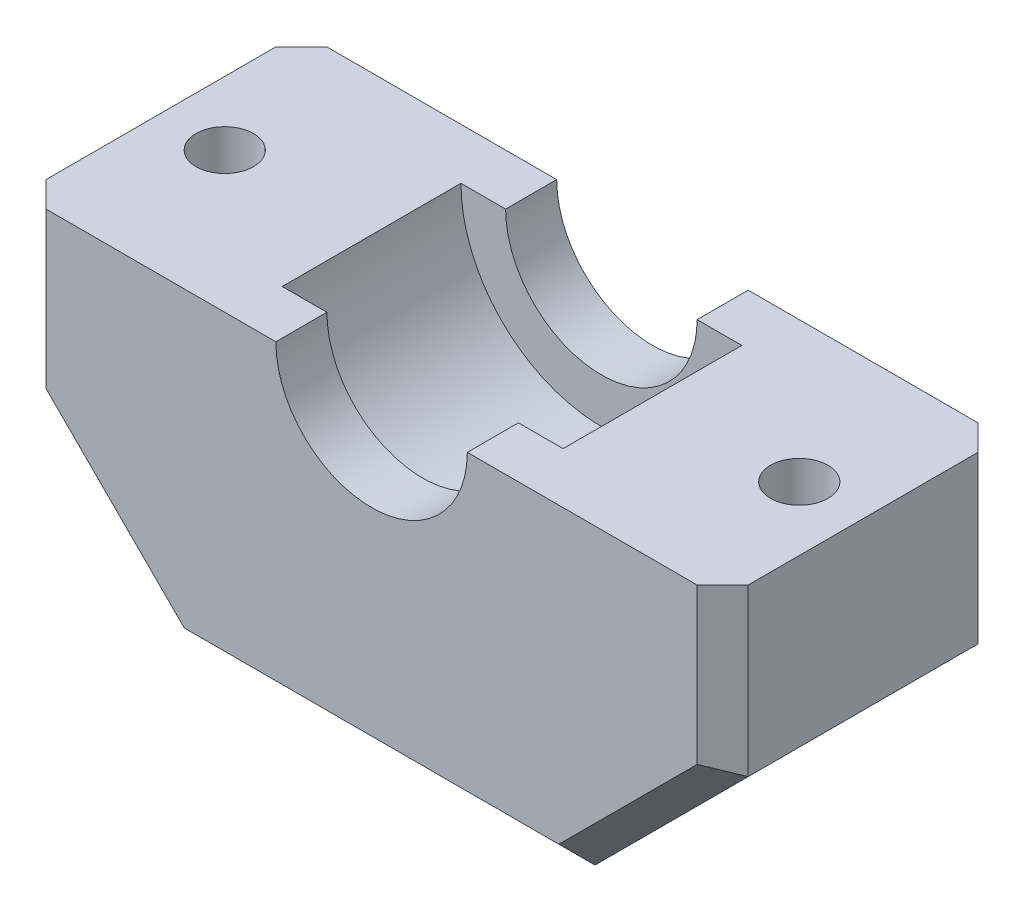
ISO-10303-21;
HEADER;
FILE_DESCRIPTION(('STEP AP214'),'2;1');
FILE_NAME('part.step','',(''),(''),'','','');
FILE_SCHEMA(('AUTOMOTIVE_DESIGN { 1 0 10303 214 1 1 1 1 }'));
ENDSEC;
DATA;
#1=APPLICATION_CONTEXT('core data for automotive mechanical design processes');
#2=APPLICATION_PROTOCOL_DEFINITION('international standard','automotive_design',2000,#1);
#3=PRODUCT_CONTEXT('',#1,'mechanical');
#4=PRODUCT('Part','Part','',(#3));
#5=PRODUCT_RELATED_PRODUCT_CATEGORY('part','',(#4));
#6=PRODUCT_DEFINITION_FORMATION('','',#4);
#7=PRODUCT_DEFINITION_CONTEXT('part definition',#1,'design');
#8=PRODUCT_DEFINITION('design','',#6,#7);
#9=PRODUCT_DEFINITION_SHAPE('','',#8);
#10=(LENGTH_UNIT() NAMED_UNIT(*) SI_UNIT(.MILLI.,.METRE.));
#11=(NAMED_UNIT(*) PLANE_ANGLE_UNIT() SI_UNIT($,.RADIAN.));
#12=(NAMED_UNIT(*) SI_UNIT($,.STERADIAN.) SOLID_ANGLE_UNIT());
#13=UNCERTAINTY_MEASURE_WITH_UNIT(LENGTH_MEASURE(1.E-05),#10,'distance_accuracy_value','');
#14=(GEOMETRIC_REPRESENTATION_CONTEXT(3) GLOBAL_UNCERTAINTY_ASSIGNED_CONTEXT((#13)) GLOBAL_UNIT_ASSIGNED_CONTEXT((#10,
#11,#12)) REPRESENTATION_CONTEXT('',''));
#15=CARTESIAN_POINT('',(0.,0.,0.));
#16=DIRECTION('',(0.,0.,1.));
#17=DIRECTION('',(1.,0.,0.));
#18=AXIS2_PLACEMENT_3D('',#15,#16,#17);
#19=CARTESIAN_POINT('',(-21.485549132948,2.02890173410404,39.1311896062463));
#20=DIRECTION('',(0.,0.,-1.));
#21=DIRECTION('',(-1.,0.,0.));
#22=AXIS2_PLACEMENT_3D('',#19,#20,#21);
#23=CYLINDRICAL_SURFACE('',#22,11.);
#24=DIRECTION('',(0.,0.,-1.));
#25=VECTOR('',#24,1.);
#26=CARTESIAN_POINT('',(-10.485549132948,2.02890173410404,39.1311896062463));
#27=LINE('',#26,#25);
#28=CARTESIAN_POINT('',(-10.485549132948,2.02890173410404,-4.));
#29=VERTEX_POINT('',#28);
#30=CARTESIAN_POINT('',(-10.485549132948,2.02890173410404,-18.));
#31=VERTEX_POINT('',#30);
#32=EDGE_CURVE('E182',#29,#31,#27,.T.);
#33=ORIENTED_EDGE('',*,*,#32,.T.);
#34=CARTESIAN_POINT('',(-21.485549132948,2.02890173410404,-18.));
#35=DIRECTION('',(0.,0.,-1.));
#36=DIRECTION('',(-1.,0.,0.));
#37=AXIS2_PLACEMENT_3D('',#34,#35,#36);
#38=CIRCLE('',#37,11.);
#39=CARTESIAN_POINT('',(-32.485549132948,2.02890173410404,-18.));
#40=VERTEX_POINT('',#39);
#41=EDGE_CURVE('E175',#31,#40,#38,.T.);
#42=ORIENTED_EDGE('',*,*,#41,.T.);
#43=DIRECTION('',(0.,0.,-1.));
#44=VECTOR('',#43,1.);
#45=CARTESIAN_POINT('',(-32.485549132948,2.02890173410404,39.1311896062463));
#46=LINE('',#45,#44);
#47=CARTESIAN_POINT('',(-32.485549132948,2.02890173410404,-4.));
#48=VERTEX_POINT('',#47);
#49=EDGE_CURVE('E67',#48,#40,#46,.T.);
#50=ORIENTED_EDGE('',*,*,#49,.F.);
#51=CARTESIAN_POINT('',(-21.485549132948,2.02890173410404,-4.));
#52=DIRECTION('',(0.,0.,1.));
#53=DIRECTION('',(1.,0.,0.));
#54=AXIS2_PLACEMENT_3D('',#51,#52,#53);
#55=CIRCLE('',#54,11.);
#56=EDGE_CURVE('E62',#48,#29,#55,.T.);
#57=ORIENTED_EDGE('',*,*,#56,.T.);
#58=EDGE_LOOP('',(#33,#42,#50,#57));
#59=FACE_BOUND('',#58,.T.);
#60=ADVANCED_FACE('F45',(#59),#23,.F.);
#61=CARTESIAN_POINT('',(-43.985549132948,8.39286276478297,-11.));
#62=DIRECTION('',(0.,-1.,0.));
#63=DIRECTION('',(0.,0.,-1.));
#64=AXIS2_PLACEMENT_3D('',#61,#62,#63);
#65=CYLINDRICAL_SURFACE('',#64,2.25);
#66=CARTESIAN_POINT('',(-43.985549132948,2.02890173410404,-11.));
#67=DIRECTION('',(0.,-1.,0.));
#68=DIRECTION('',(1.,0.,0.));
#69=AXIS2_PLACEMENT_3D('',#66,#67,#68);
#70=CIRCLE('',#69,2.25);
#71=CARTESIAN_POINT('',(-41.735549132948,2.02890173410404,-11.));
#72=VERTEX_POINT('',#71);
#73=EDGE_CURVE('E217',#72,#72,#70,.F.);
#74=ORIENTED_EDGE('',*,*,#73,.T.);
#75=EDGE_LOOP('',(#74));
#76=FACE_BOUND('',#75,.T.);
#77=CARTESIAN_POINT('',(-43.985549132948,-1.97109826589596,-11.));
#78=DIRECTION('',(0.,-1.,0.));
#79=DIRECTION('',(1.,0.,0.));
#80=AXIS2_PLACEMENT_3D('',#77,#78,#79);
#81=CIRCLE('',#80,2.25);
#82=CARTESIAN_POINT('',(-41.735549132948,-1.97109826589596,-11.));
#83=VERTEX_POINT('',#82);
#84=EDGE_CURVE('E202',#83,#83,#81,.F.);
#85=ORIENTED_EDGE('',*,*,#84,.F.);
#86=EDGE_LOOP('',(#85));
#87=FACE_BOUND('',#86,.T.);
#88=ADVANCED_FACE('F412',(#76,#87),#65,.F.);
#89=CARTESIAN_POINT('',(1.01445086705203,8.39286276478297,-11.));
#90=DIRECTION('',(0.,-1.,0.));
#91=DIRECTION('',(0.,0.,-1.));
#92=AXIS2_PLACEMENT_3D('',#89,#90,#91);
#93=CYLINDRICAL_SURFACE('',#92,2.25);
#94=CARTESIAN_POINT('',(1.01445086705203,2.02890173410404,-11.));
#95=DIRECTION('',(0.,-1.,0.));
#96=DIRECTION('',(1.,0.,0.));
#97=AXIS2_PLACEMENT_3D('',#94,#95,#96);
#98=CIRCLE('',#97,2.25);
#99=CARTESIAN_POINT('',(3.26445086705203,2.02890173410404,-11.));
#100=VERTEX_POINT('',#99);
#101=EDGE_CURVE('E214',#100,#100,#98,.F.);
#102=ORIENTED_EDGE('',*,*,#101,.T.);
#103=EDGE_LOOP('',(#102));
#104=FACE_BOUND('',#103,.T.);
#105=CARTESIAN_POINT('',(1.01445086705203,-1.97109826589597,-11.));
#106=DIRECTION('',(0.,-1.,0.));
#107=DIRECTION('',(1.,0.,0.));
#108=AXIS2_PLACEMENT_3D('',#105,#106,#107);
#109=CIRCLE('',#108,2.25);
#110=CARTESIAN_POINT('',(3.26445086705203,-1.97109826589597,-11.));
#111=VERTEX_POINT('',#110);
#112=EDGE_CURVE('E210',#111,#111,#109,.F.);
#113=ORIENTED_EDGE('',*,*,#112,.F.);
#114=EDGE_LOOP('',(#113));
#115=FACE_BOUND('',#114,.T.);
#116=ADVANCED_FACE('F417',(#104,#115),#93,.F.);
#117=CARTESIAN_POINT('',(6.01445086705203,2.02890173410404,-22.));
#118=DIRECTION('',(0.,-1.,0.));
#119=DIRECTION('',(1.,0.,0.));
#120=AXIS2_PLACEMENT_3D('',#117,#118,#119);
#121=PLANE('',#120);
#122=ORIENTED_EDGE('',*,*,#101,.F.);
#123=EDGE_LOOP('',(#122));
#124=FACE_BOUND('',#123,.T.);
#125=DIRECTION('',(1.,0.,0.));
#126=VECTOR('',#125,1.);
#127=CARTESIAN_POINT('',(6.01445086705203,2.02890173410404,0.));
#128=LINE('',#127,#126);
#129=CARTESIAN_POINT('',(-13.985549132948,2.02890173410404,0.));
#130=VERTEX_POINT('',#129);
#131=CARTESIAN_POINT('',(4.01445086705202,2.02890173410404,0.));
#132=VERTEX_POINT('',#131);
#133=EDGE_CURVE('E220',#130,#132,#128,.T.);
#134=ORIENTED_EDGE('',*,*,#133,.T.);
#135=DIRECTION('',(0.707106781186546,0.,-0.707106781186549));
#136=VECTOR('',#135,1.);
#137=CARTESIAN_POINT('',(6.01445086705203,2.02890173410404,-2.00000000000002));
#138=LINE('',#137,#136);
#139=CARTESIAN_POINT('',(6.01445086705203,2.02890173410404,-2.00000000000002));
#140=VERTEX_POINT('',#139);
#141=EDGE_CURVE('E280',#132,#140,#138,.T.);
#142=ORIENTED_EDGE('',*,*,#141,.T.);
#143=DIRECTION('',(0.,0.,1.));
#144=VECTOR('',#143,1.);
#145=CARTESIAN_POINT('',(6.01445086705203,2.02890173410404,-22.));
#146=LINE('',#145,#144);
#147=CARTESIAN_POINT('',(6.01445086705203,2.02890173410404,-20.));
#148=VERTEX_POINT('',#147);
#149=EDGE_CURVE('E232',#148,#140,#146,.T.);
#150=ORIENTED_EDGE('',*,*,#149,.F.);
#151=DIRECTION('',(0.707106781186546,0.,0.707106781186549));
#152=VECTOR('',#151,1.);
#153=CARTESIAN_POINT('',(4.01445086705204,2.02890173410404,-22.));
#154=LINE('',#153,#152);
#155=CARTESIAN_POINT('',(4.01445086705204,2.02890173410404,-22.));
#156=VERTEX_POINT('',#155);
#157=EDGE_CURVE('E278',#148,#156,#154,.F.);
#158=ORIENTED_EDGE('',*,*,#157,.T.);
#159=DIRECTION('',(1.,0.,0.));
#160=VECTOR('',#159,1.);
#161=CARTESIAN_POINT('',(6.01445086705203,2.02890173410404,-22.));
#162=LINE('',#161,#160);
#163=CARTESIAN_POINT('',(-13.985549132948,2.02890173410404,-22.));
#164=VERTEX_POINT('',#163);
#165=EDGE_CURVE('E221',#164,#156,#162,.T.);
#166=ORIENTED_EDGE('',*,*,#165,.F.);
#167=DIRECTION('',(0.,0.,-1.));
#168=VECTOR('',#167,1.);
#169=CARTESIAN_POINT('',(-13.985549132948,2.02890173410404,-18.));
#170=LINE('',#169,#168);
#171=CARTESIAN_POINT('',(-13.985549132948,2.02890173410404,-18.));
#172=VERTEX_POINT('',#171);
#173=EDGE_CURVE('E335',#172,#164,#170,.T.);
#174=ORIENTED_EDGE('',*,*,#173,.F.);
#175=DIRECTION('',(1.,0.,0.));
#176=VECTOR('',#175,1.);
#177=CARTESIAN_POINT('',(-10.485549132948,2.02890173410404,-18.));
#178=LINE('',#177,#176);
#179=EDGE_CURVE('E336',#172,#31,#178,.T.);
#180=ORIENTED_EDGE('',*,*,#179,.T.);
#181=ORIENTED_EDGE('',*,*,#32,.F.);
#182=DIRECTION('',(-1.,0.,0.));
#183=VECTOR('',#182,1.);
#184=CARTESIAN_POINT('',(-10.485549132948,2.02890173410404,-4.));
#185=LINE('',#184,#183);
#186=CARTESIAN_POINT('',(-13.985549132948,2.02890173410404,-4.));
#187=VERTEX_POINT('',#186);
#188=EDGE_CURVE('E347',#29,#187,#185,.T.);
#189=ORIENTED_EDGE('',*,*,#188,.T.);
#190=DIRECTION('',(0.,0.,1.));
#191=VECTOR('',#190,1.);
#192=CARTESIAN_POINT('',(-13.985549132948,2.02890173410404,-4.));
#193=LINE('',#192,#191);
#194=EDGE_CURVE('E195',#187,#130,#193,.T.);
#195=ORIENTED_EDGE('',*,*,#194,.T.);
#196=EDGE_LOOP('',(#134,#142,#150,#158,#166,#174,#180,#181,#189,#195));
#197=FACE_BOUND('',#196,.T.);
#198=ADVANCED_FACE('F358',(#124,#197),#121,.F.);
#199=CARTESIAN_POINT('',(6.01445086705203,-22.971098265896,-22.));
#200=DIRECTION('',(-1.,0.,0.));
#201=DIRECTION('',(0.,0.,1.));
#202=AXIS2_PLACEMENT_3D('',#199,#200,#201);
#203=PLANE('',#202);
#204=ORIENTED_EDGE('',*,*,#149,.T.);
#205=DIRECTION('',(0.,-1.,0.));
#206=VECTOR('',#205,1.);
#207=CARTESIAN_POINT('',(6.01445086705203,-10.9710982658959,-2.00000000000002));
#208=LINE('',#207,#206);
#209=CARTESIAN_POINT('',(6.01445086705203,-10.9710982658959,-2.00000000000002));
#210=VERTEX_POINT('',#209);
#211=EDGE_CURVE('E276',#140,#210,#208,.T.);
#212=ORIENTED_EDGE('',*,*,#211,.T.);
#213=DIRECTION('',(0.,0.,-1.));
#214=VECTOR('',#213,1.);
#215=CARTESIAN_POINT('',(6.01445086705203,-10.9710982658959,-22.));
#216=LINE('',#215,#214);
#217=CARTESIAN_POINT('',(6.01445086705203,-10.9710982658959,-20.));
#218=VERTEX_POINT('',#217);
#219=EDGE_CURVE('E241',#210,#218,#216,.T.);
#220=ORIENTED_EDGE('',*,*,#219,.T.);
#221=DIRECTION('',(0.,1.,0.));
#222=VECTOR('',#221,1.);
#223=CARTESIAN_POINT('',(6.01445086705203,-22.971098265896,-20.));
#224=LINE('',#223,#222);
#225=EDGE_CURVE('E274',#218,#148,#224,.T.);
#226=ORIENTED_EDGE('',*,*,#225,.T.);
#227=EDGE_LOOP('',(#204,#212,#220,#226));
#228=FACE_BOUND('',#227,.T.);
#229=ADVANCED_FACE('F395',(#228),#203,.F.);
#230=CARTESIAN_POINT('',(-48.985549132948,-22.971098265896,-22.));
#231=DIRECTION('',(0.,1.,0.));
#232=DIRECTION('',(0.,0.,1.));
#233=AXIS2_PLACEMENT_3D('',#230,#231,#232);
#234=PLANE('',#233);
#235=DIRECTION('',(0.,0.,1.));
#236=VECTOR('',#235,1.);
#237=CARTESIAN_POINT('',(-5.985549132948,-22.971098265896,-22.));
#238=LINE('',#237,#236);
#239=CARTESIAN_POINT('',(-5.985549132948,-22.971098265896,-20.));
#240=VERTEX_POINT('',#239);
#241=CARTESIAN_POINT('',(-5.985549132948,-22.971098265896,-2.00000000000002));
#242=VERTEX_POINT('',#241);
#243=EDGE_CURVE('E238',#240,#242,#238,.T.);
#244=ORIENTED_EDGE('',*,*,#243,.T.);
#245=DIRECTION('',(-1.,0.,0.));
#246=VECTOR('',#245,1.);
#247=CARTESIAN_POINT('',(-36.9855491329479,-22.971098265896,-2.00000000000002));
#248=LINE('',#247,#246);
#249=CARTESIAN_POINT('',(-36.9855491329479,-22.971098265896,-2.00000000000002));
#250=VERTEX_POINT('',#249);
#251=EDGE_CURVE('E284',#242,#250,#248,.T.);
#252=ORIENTED_EDGE('',*,*,#251,.T.);
#253=DIRECTION('',(0.,0.,-1.));
#254=VECTOR('',#253,1.);
#255=CARTESIAN_POINT('',(-36.9855491329479,-22.971098265896,-22.));
#256=LINE('',#255,#254);
#257=CARTESIAN_POINT('',(-36.9855491329479,-22.971098265896,-20.));
#258=VERTEX_POINT('',#257);
#259=EDGE_CURVE('E235',#250,#258,#256,.T.);
#260=ORIENTED_EDGE('',*,*,#259,.T.);
#261=DIRECTION('',(1.,0.,0.));
#262=VECTOR('',#261,1.);
#263=CARTESIAN_POINT('',(-48.985549132948,-22.971098265896,-20.));
#264=LINE('',#263,#262);
#265=EDGE_CURVE('E282',#258,#240,#264,.T.);
#266=ORIENTED_EDGE('',*,*,#265,.T.);
#267=EDGE_LOOP('',(#244,#252,#260,#266));
#268=FACE_BOUND('',#267,.T.);
#269=ADVANCED_FACE('F385',(#268),#234,.F.);
#270=CARTESIAN_POINT('',(-48.985549132948,2.02890173410404,-22.));
#271=DIRECTION('',(1.,0.,0.));
#272=DIRECTION('',(0.,0.,-1.));
#273=AXIS2_PLACEMENT_3D('',#270,#271,#272);
#274=PLANE('',#273);
#275=DIRECTION('',(0.,0.,1.));
#276=VECTOR('',#275,1.);
#277=CARTESIAN_POINT('',(-48.985549132948,-10.9710982658959,-22.));
#278=LINE('',#277,#276);
#279=CARTESIAN_POINT('',(-48.985549132948,-10.9710982658959,-20.));
#280=VERTEX_POINT('',#279);
#281=CARTESIAN_POINT('',(-48.985549132948,-10.9710982658959,-2.00000000000002));
#282=VERTEX_POINT('',#281);
#283=EDGE_CURVE('E244',#280,#282,#278,.T.);
#284=ORIENTED_EDGE('',*,*,#283,.T.);
#285=DIRECTION('',(0.,1.,0.));
#286=VECTOR('',#285,1.);
#287=CARTESIAN_POINT('',(-48.985549132948,2.02890173410404,-2.00000000000002));
#288=LINE('',#287,#286);
#289=CARTESIAN_POINT('',(-48.985549132948,2.02890173410404,-2.00000000000002));
#290=VERTEX_POINT('',#289);
#291=EDGE_CURVE('E253',#282,#290,#288,.T.);
#292=ORIENTED_EDGE('',*,*,#291,.T.);
#293=DIRECTION('',(0.,0.,1.));
#294=VECTOR('',#293,1.);
#295=CARTESIAN_POINT('',(-48.985549132948,2.02890173410404,-22.));
#296=LINE('',#295,#294);
#297=CARTESIAN_POINT('',(-48.985549132948,2.02890173410404,-20.));
#298=VERTEX_POINT('',#297);
#299=EDGE_CURVE('E227',#298,#290,#296,.T.);
#300=ORIENTED_EDGE('',*,*,#299,.F.);
#301=DIRECTION('',(0.,-1.,0.));
#302=VECTOR('',#301,1.);
#303=CARTESIAN_POINT('',(-48.985549132948,2.02890173410404,-20.));
#304=LINE('',#303,#302);
#305=EDGE_CURVE('E247',#298,#280,#304,.T.);
#306=ORIENTED_EDGE('',*,*,#305,.T.);
#307=EDGE_LOOP('',(#284,#292,#300,#306));
#308=FACE_BOUND('',#307,.T.);
#309=ADVANCED_FACE('F447',(#308),#274,.F.);
#310=CARTESIAN_POINT('',(-38.985549132948,2.02890173410404,-22.));
#311=DIRECTION('',(0.,-1.,0.));
#312=DIRECTION('',(1.,0.,0.));
#313=AXIS2_PLACEMENT_3D('',#310,#311,#312);
#314=PLANE('',#313);
#315=ORIENTED_EDGE('',*,*,#73,.F.);
#316=EDGE_LOOP('',(#315));
#317=FACE_BOUND('',#316,.T.);
#318=ORIENTED_EDGE('',*,*,#299,.T.);
#319=DIRECTION('',(0.707106781186546,0.,0.707106781186549));
#320=VECTOR('',#319,1.);
#321=CARTESIAN_POINT('',(-48.985549132948,2.02890173410404,-2.00000000000002));
#322=LINE('',#321,#320);
#323=CARTESIAN_POINT('',(-46.985549132948,2.02890173410404,0.));
#324=VERTEX_POINT('',#323);
#325=EDGE_CURVE('E258',#290,#324,#322,.T.);
#326=ORIENTED_EDGE('',*,*,#325,.T.);
#327=DIRECTION('',(1.,0.,0.));
#328=VECTOR('',#327,1.);
#329=CARTESIAN_POINT('',(-38.985549132948,2.02890173410404,0.));
#330=LINE('',#329,#328);
#331=CARTESIAN_POINT('',(-28.985549132948,2.02890173410404,0.));
#332=VERTEX_POINT('',#331);
#333=EDGE_CURVE('E225',#324,#332,#330,.T.);
#334=ORIENTED_EDGE('',*,*,#333,.T.);
#335=DIRECTION('',(0.,0.,1.));
#336=VECTOR('',#335,1.);
#337=CARTESIAN_POINT('',(-28.985549132948,2.02890173410404,-4.));
#338=LINE('',#337,#336);
#339=CARTESIAN_POINT('',(-28.985549132948,2.02890173410404,-4.));
#340=VERTEX_POINT('',#339);
#341=EDGE_CURVE('E190',#340,#332,#338,.T.);
#342=ORIENTED_EDGE('',*,*,#341,.F.);
#343=DIRECTION('',(-1.,0.,0.));
#344=VECTOR('',#343,1.);
#345=CARTESIAN_POINT('',(-32.485549132948,2.02890173410404,-4.));
#346=LINE('',#345,#344);
#347=EDGE_CURVE('E189',#340,#48,#346,.T.);
#348=ORIENTED_EDGE('',*,*,#347,.T.);
#349=ORIENTED_EDGE('',*,*,#49,.T.);
#350=DIRECTION('',(1.,0.,0.));
#351=VECTOR('',#350,1.);
#352=CARTESIAN_POINT('',(-32.485549132948,2.02890173410404,-18.));
#353=LINE('',#352,#351);
#354=CARTESIAN_POINT('',(-28.985549132948,2.02890173410404,-18.));
#355=VERTEX_POINT('',#354);
#356=EDGE_CURVE('E172',#40,#355,#353,.T.);
#357=ORIENTED_EDGE('',*,*,#356,.T.);
#358=DIRECTION('',(0.,0.,-1.));
#359=VECTOR('',#358,1.);
#360=CARTESIAN_POINT('',(-28.985549132948,2.02890173410404,-18.));
#361=LINE('',#360,#359);
#362=CARTESIAN_POINT('',(-28.985549132948,2.02890173410404,-22.));
#363=VERTEX_POINT('',#362);
#364=EDGE_CURVE('E332',#355,#363,#361,.T.);
#365=ORIENTED_EDGE('',*,*,#364,.T.);
#366=DIRECTION('',(1.,0.,0.));
#367=VECTOR('',#366,1.);
#368=CARTESIAN_POINT('',(-38.985549132948,2.02890173410404,-22.));
#369=LINE('',#368,#367);
#370=CARTESIAN_POINT('',(-46.985549132948,2.02890173410404,-22.));
#371=VERTEX_POINT('',#370);
#372=EDGE_CURVE('E224',#371,#363,#369,.T.);
#373=ORIENTED_EDGE('',*,*,#372,.F.);
#374=DIRECTION('',(0.707106781186546,0.,-0.707106781186549));
#375=VECTOR('',#374,1.);
#376=CARTESIAN_POINT('',(-46.985549132948,2.02890173410404,-22.));
#377=LINE('',#376,#375);
#378=EDGE_CURVE('E256',#371,#298,#377,.F.);
#379=ORIENTED_EDGE('',*,*,#378,.T.);
#380=EDGE_LOOP('',(#318,#326,#334,#342,#348,#349,#357,#365,#373,#379));
#381=FACE_BOUND('',#380,.T.);
#382=ADVANCED_FACE('F187',(#317,#381),#314,.F.);
#383=CARTESIAN_POINT('',(-21.485549132948,2.02890173410404,-22.));
#384=DIRECTION('',(0.,0.,1.));
#385=DIRECTION('',(1.,0.,0.));
#386=AXIS2_PLACEMENT_3D('',#383,#384,#385);
#387=PLANE('',#386);
#388=ORIENTED_EDGE('',*,*,#165,.T.);
#389=DIRECTION('',(0.,-1.,0.));
#390=VECTOR('',#389,1.);
#391=CARTESIAN_POINT('',(4.01445086705204,2.02890173410404,-22.));
#392=LINE('',#391,#390);
#393=CARTESIAN_POINT('',(4.01445086705204,-10.1426711411497,-22.));
#394=VERTEX_POINT('',#393);
#395=EDGE_CURVE('E13',#156,#394,#392,.T.);
#396=ORIENTED_EDGE('',*,*,#395,.T.);
#397=DIRECTION('',(-0.707106781186548,-0.707106781186548,0.));
#398=VECTOR('',#397,1.);
#399=CARTESIAN_POINT('',(-7.39976269532109,-21.5568847035229,-22.));
#400=LINE('',#399,#398);
#401=CARTESIAN_POINT('',(-6.81397625769419,-20.971098265896,-22.));
#402=VERTEX_POINT('',#401);
#403=EDGE_CURVE('E290',#394,#402,#400,.T.);
#404=ORIENTED_EDGE('',*,*,#403,.T.);
#405=DIRECTION('',(-1.,0.,0.));
#406=VECTOR('',#405,1.);
#407=CARTESIAN_POINT('',(-21.485549132948,-20.971098265896,-22.));
#408=LINE('',#407,#406);
#409=CARTESIAN_POINT('',(-36.1571220082017,-20.971098265896,-22.));
#410=VERTEX_POINT('',#409);
#411=EDGE_CURVE('E292',#402,#410,#408,.T.);
#412=ORIENTED_EDGE('',*,*,#411,.T.);
#413=DIRECTION('',(-0.707106781186547,0.707106781186548,0.));
#414=VECTOR('',#413,1.);
#415=CARTESIAN_POINT('',(-47.5713355705749,-9.55688470352282,-22.));
#416=LINE('',#415,#414);
#417=CARTESIAN_POINT('',(-46.985549132948,-10.1426711411497,-22.));
#418=VERTEX_POINT('',#417);
#419=EDGE_CURVE('E294',#410,#418,#416,.T.);
#420=ORIENTED_EDGE('',*,*,#419,.T.);
#421=DIRECTION('',(0.,1.,0.));
#422=VECTOR('',#421,1.);
#423=CARTESIAN_POINT('',(-46.985549132948,2.02890173410404,-22.));
#424=LINE('',#423,#422);
#425=EDGE_CURVE('E54',#418,#371,#424,.T.);
#426=ORIENTED_EDGE('',*,*,#425,.T.);
#427=ORIENTED_EDGE('',*,*,#372,.T.);
#428=CARTESIAN_POINT('',(-21.485549132948,2.02890173410404,-22.));
#429=DIRECTION('',(0.,0.,1.));
#430=DIRECTION('',(-1.,0.,0.));
#431=AXIS2_PLACEMENT_3D('',#428,#429,#430);
#432=CIRCLE('',#431,7.5);
#433=EDGE_CURVE('E183',#363,#164,#432,.T.);
#434=ORIENTED_EDGE('',*,*,#433,.T.);
#435=EDGE_LOOP('',(#388,#396,#404,#412,#420,#426,#427,#434));
#436=FACE_BOUND('',#435,.T.);
#437=ADVANCED_FACE('F329',(#436),#387,.F.);
#438=CARTESIAN_POINT('',(-21.485549132948,2.02890173410404,0.));
#439=DIRECTION('',(0.,0.,1.));
#440=DIRECTION('',(1.,0.,0.));
#441=AXIS2_PLACEMENT_3D('',#438,#439,#440);
#442=PLANE('',#441);
#443=ORIENTED_EDGE('',*,*,#333,.F.);
#444=DIRECTION('',(0.,-1.,0.));
#445=VECTOR('',#444,1.);
#446=CARTESIAN_POINT('',(-46.985549132948,-10.9710982658959,0.));
#447=LINE('',#446,#445);
#448=CARTESIAN_POINT('',(-46.985549132948,-10.1426711411497,0.));
#449=VERTEX_POINT('',#448);
#450=EDGE_CURVE('E268',#324,#449,#447,.T.);
#451=ORIENTED_EDGE('',*,*,#450,.T.);
#452=DIRECTION('',(0.707106781186547,-0.707106781186548,0.));
#453=VECTOR('',#452,1.);
#454=CARTESIAN_POINT('',(-40.3213355705749,-16.8068847035228,0.));
#455=LINE('',#454,#453);
#456=CARTESIAN_POINT('',(-36.1571220082017,-20.9710982658959,0.));
#457=VERTEX_POINT('',#456);
#458=EDGE_CURVE('E266',#449,#457,#455,.T.);
#459=ORIENTED_EDGE('',*,*,#458,.T.);
#460=DIRECTION('',(1.,0.,0.));
#461=VECTOR('',#460,1.);
#462=CARTESIAN_POINT('',(-5.985549132948,-20.9710982658959,0.));
#463=LINE('',#462,#461);
#464=CARTESIAN_POINT('',(-6.8139762576942,-20.9710982658959,0.));
#465=VERTEX_POINT('',#464);
#466=EDGE_CURVE('E262',#457,#465,#463,.T.);
#467=ORIENTED_EDGE('',*,*,#466,.T.);
#468=DIRECTION('',(0.707106781186548,0.707106781186548,0.));
#469=VECTOR('',#468,1.);
#470=CARTESIAN_POINT('',(-2.64976269532109,-16.8068847035228,0.));
#471=LINE('',#470,#469);
#472=CARTESIAN_POINT('',(4.01445086705202,-10.1426711411497,0.));
#473=VERTEX_POINT('',#472);
#474=EDGE_CURVE('E260',#465,#473,#471,.T.);
#475=ORIENTED_EDGE('',*,*,#474,.T.);
#476=DIRECTION('',(0.,1.,0.));
#477=VECTOR('',#476,1.);
#478=CARTESIAN_POINT('',(4.01445086705202,2.02890173410404,0.));
#479=LINE('',#478,#477);
#480=EDGE_CURVE('E264',#473,#132,#479,.T.);
#481=ORIENTED_EDGE('',*,*,#480,.T.);
#482=ORIENTED_EDGE('',*,*,#133,.F.);
#483=CARTESIAN_POINT('',(-21.485549132948,2.02890173410404,0.));
#484=DIRECTION('',(0.,0.,-1.));
#485=DIRECTION('',(1.,0.,0.));
#486=AXIS2_PLACEMENT_3D('',#483,#484,#485);
#487=CIRCLE('',#486,7.5);
#488=EDGE_CURVE('E344',#130,#332,#487,.T.);
#489=ORIENTED_EDGE('',*,*,#488,.T.);
#490=EDGE_LOOP('',(#443,#451,#459,#467,#475,#481,#482,#489));
#491=FACE_BOUND('',#490,.T.);
#492=ADVANCED_FACE('F366',(#491),#442,.T.);
#493=CARTESIAN_POINT('',(-5.985549132948,-22.971098265896,-22.));
#494=DIRECTION('',(-0.707106781186548,0.707106781186548,0.));
#495=DIRECTION('',(0.,0.,1.));
#496=AXIS2_PLACEMENT_3D('',#493,#494,#495);
#497=PLANE('',#496);
#498=CARTESIAN_POINT('',(1.01445086705203,-15.9710982658959,-11.));
#499=DIRECTION('',(-0.707106781186548,0.707106781186548,0.));
#500=DIRECTION('',(-0.707106781186548,-0.707106781186548,0.));
#501=AXIS2_PLACEMENT_3D('',#498,#499,#500);
#502=ELLIPSE('',#501,6.36396103067893,4.5);
#503=CARTESIAN_POINT('',(-3.48554913294797,-20.4710982658959,-11.));
#504=VERTEX_POINT('',#503);
#505=EDGE_CURVE('E213',#504,#504,#502,.F.);
#506=ORIENTED_EDGE('',*,*,#505,.F.);
#507=EDGE_LOOP('',(#506));
#508=FACE_BOUND('',#507,.T.);
#509=ORIENTED_EDGE('',*,*,#219,.F.);
#510=DIRECTION('',(0.707106781186548,0.707106781186548,0.));
#511=VECTOR('',#510,1.);
#512=CARTESIAN_POINT('',(-5.985549132948,-22.971098265896,-2.00000000000002));
#513=LINE('',#512,#511);
#514=EDGE_CURVE('E288',#210,#242,#513,.F.);
#515=ORIENTED_EDGE('',*,*,#514,.T.);
#516=ORIENTED_EDGE('',*,*,#243,.F.);
#517=DIRECTION('',(-0.707106781186548,-0.707106781186548,0.));
#518=VECTOR('',#517,1.);
#519=CARTESIAN_POINT('',(6.01445086705203,-10.9710982658959,-20.));
#520=LINE('',#519,#518);
#521=EDGE_CURVE('E286',#240,#218,#520,.F.);
#522=ORIENTED_EDGE('',*,*,#521,.T.);
#523=EDGE_LOOP('',(#509,#515,#516,#522));
#524=FACE_BOUND('',#523,.T.);
#525=ADVANCED_FACE('F382',(#508,#524),#497,.F.);
#526=CARTESIAN_POINT('',(-48.985549132948,-10.9710982658959,-22.));
#527=DIRECTION('',(0.707106781186548,0.707106781186547,0.));
#528=DIRECTION('',(0.,0.,1.));
#529=AXIS2_PLACEMENT_3D('',#526,#527,#528);
#530=PLANE('',#529);
#531=CARTESIAN_POINT('',(-43.985549132948,-15.9710982658959,-11.));
#532=DIRECTION('',(0.707106781186548,0.707106781186547,0.));
#533=DIRECTION('',(0.707106781186547,-0.707106781186548,0.));
#534=AXIS2_PLACEMENT_3D('',#531,#532,#533);
#535=ELLIPSE('',#534,6.36396103067893,4.5);
#536=CARTESIAN_POINT('',(-39.485549132948,-20.4710982658959,-11.));
#537=VERTEX_POINT('',#536);
#538=EDGE_CURVE('E206',#537,#537,#535,.F.);
#539=ORIENTED_EDGE('',*,*,#538,.F.);
#540=EDGE_LOOP('',(#539));
#541=FACE_BOUND('',#540,.T.);
#542=ORIENTED_EDGE('',*,*,#259,.F.);
#543=DIRECTION('',(0.707106781186547,-0.707106781186548,0.));
#544=VECTOR('',#543,1.);
#545=CARTESIAN_POINT('',(-48.985549132948,-10.9710982658959,-2.00000000000002));
#546=LINE('',#545,#544);
#547=EDGE_CURVE('E272',#250,#282,#546,.F.);
#548=ORIENTED_EDGE('',*,*,#547,.T.);
#549=ORIENTED_EDGE('',*,*,#283,.F.);
#550=DIRECTION('',(-0.707106781186547,0.707106781186548,0.));
#551=VECTOR('',#550,1.);
#552=CARTESIAN_POINT('',(-36.9855491329479,-22.971098265896,-20.));
#553=LINE('',#552,#551);
#554=EDGE_CURVE('E270',#280,#258,#553,.F.);
#555=ORIENTED_EDGE('',*,*,#554,.T.);
#556=EDGE_LOOP('',(#542,#548,#549,#555));
#557=FACE_BOUND('',#556,.T.);
#558=ADVANCED_FACE('F436',(#541,#557),#530,.F.);
#559=CARTESIAN_POINT('',(1.01445086705203,14.7568237954619,-11.));
#560=DIRECTION('',(0.,-1.,0.));
#561=DIRECTION('',(0.,0.,-1.));
#562=AXIS2_PLACEMENT_3D('',#559,#560,#561);
#563=CYLINDRICAL_SURFACE('',#562,4.5);
#564=ORIENTED_EDGE('',*,*,#505,.T.);
#565=EDGE_LOOP('',(#564));
#566=FACE_BOUND('',#565,.T.);
#567=CARTESIAN_POINT('',(1.01445086705203,-1.97109826589597,-11.));
#568=DIRECTION('',(0.,-1.,0.));
#569=DIRECTION('',(1.,0.,0.));
#570=AXIS2_PLACEMENT_3D('',#567,#568,#569);
#571=CIRCLE('',#570,4.5);
#572=CARTESIAN_POINT('',(5.51445086705203,-1.97109826589597,-11.));
#573=VERTEX_POINT('',#572);
#574=EDGE_CURVE('E207',#573,#573,#571,.F.);
#575=ORIENTED_EDGE('',*,*,#574,.T.);
#576=EDGE_LOOP('',(#575));
#577=FACE_BOUND('',#576,.T.);
#578=ADVANCED_FACE('F432',(#566,#577),#563,.F.);
#579=CARTESIAN_POINT('',(-38.985549132948,-1.97109826589596,-22.));
#580=DIRECTION('',(0.,-1.,0.));
#581=DIRECTION('',(1.,0.,0.));
#582=AXIS2_PLACEMENT_3D('',#579,#580,#581);
#583=PLANE('',#582);
#584=ORIENTED_EDGE('',*,*,#574,.F.);
#585=EDGE_LOOP('',(#584));
#586=FACE_BOUND('',#585,.T.);
#587=ORIENTED_EDGE('',*,*,#112,.T.);
#588=EDGE_LOOP('',(#587));
#589=FACE_BOUND('',#588,.T.);
#590=ADVANCED_FACE('F428',(#586,#589),#583,.T.);
#591=CARTESIAN_POINT('',(-43.985549132948,14.7568237954619,-11.));
#592=DIRECTION('',(0.,-1.,0.));
#593=DIRECTION('',(0.,0.,-1.));
#594=AXIS2_PLACEMENT_3D('',#591,#592,#593);
#595=CYLINDRICAL_SURFACE('',#594,4.5);
#596=ORIENTED_EDGE('',*,*,#538,.T.);
#597=EDGE_LOOP('',(#596));
#598=FACE_BOUND('',#597,.T.);
#599=CARTESIAN_POINT('',(-43.985549132948,-1.97109826589596,-11.));
#600=DIRECTION('',(0.,-1.,0.));
#601=DIRECTION('',(1.,0.,0.));
#602=AXIS2_PLACEMENT_3D('',#599,#600,#601);
#603=CIRCLE('',#602,4.5);
#604=CARTESIAN_POINT('',(-39.485549132948,-1.97109826589596,-11.));
#605=VERTEX_POINT('',#604);
#606=EDGE_CURVE('E199',#605,#605,#603,.F.);
#607=ORIENTED_EDGE('',*,*,#606,.T.);
#608=EDGE_LOOP('',(#607));
#609=FACE_BOUND('',#608,.T.);
#610=ADVANCED_FACE('F424',(#598,#609),#595,.F.);
#611=CARTESIAN_POINT('',(-38.985549132948,-1.97109826589596,-22.));
#612=DIRECTION('',(0.,-1.,0.));
#613=DIRECTION('',(1.,0.,0.));
#614=AXIS2_PLACEMENT_3D('',#611,#612,#613);
#615=PLANE('',#614);
#616=ORIENTED_EDGE('',*,*,#606,.F.);
#617=EDGE_LOOP('',(#616));
#618=FACE_BOUND('',#617,.T.);
#619=ORIENTED_EDGE('',*,*,#84,.T.);
#620=EDGE_LOOP('',(#619));
#621=FACE_BOUND('',#620,.T.);
#622=ADVANCED_FACE('F421',(#618,#621),#615,.T.);
#623=CARTESIAN_POINT('',(6.01445086705203,-22.971098265896,-2.00000000000002));
#624=DIRECTION('',(0.707106781186549,0.,0.707106781186546));
#625=DIRECTION('',(0.,1.,0.));
#626=AXIS2_PLACEMENT_3D('',#623,#624,#625);
#627=PLANE('',#626);
#628=ORIENTED_EDGE('',*,*,#141,.F.);
#629=ORIENTED_EDGE('',*,*,#480,.F.);
#630=DIRECTION('',(-0.678598344545846,0.28108463771482,0.678598344545848));
#631=VECTOR('',#630,1.);
#632=CARTESIAN_POINT('',(2.21676497459439,-9.39804526360699,1.79768589245764));
#633=LINE('',#632,#631);
#634=EDGE_CURVE('E203',#210,#473,#633,.T.);
#635=ORIENTED_EDGE('',*,*,#634,.F.);
#636=ORIENTED_EDGE('',*,*,#211,.F.);
#637=EDGE_LOOP('',(#628,#629,#635,#636));
#638=FACE_BOUND('',#637,.T.);
#639=ADVANCED_FACE('F372',(#638),#627,.T.);
#640=CARTESIAN_POINT('',(-2.64976269532109,-16.8068847035228,0.));
#641=DIRECTION('',(0.500000000000001,-0.500000000000001,0.707106781186547));
#642=DIRECTION('',(-0.707106781186548,-0.707106781186548,0.));
#643=AXIS2_PLACEMENT_3D('',#640,#641,#642);
#644=PLANE('',#643);
#645=ORIENTED_EDGE('',*,*,#634,.T.);
#646=ORIENTED_EDGE('',*,*,#474,.F.);
#647=DIRECTION('',(0.28108463771482,-0.678598344545846,-0.678598344545848));
#648=VECTOR('',#647,1.);
#649=CARTESIAN_POINT('',(-7.27926464455874,-19.8477927319129,1.12330553398309));
#650=LINE('',#649,#648);
#651=EDGE_CURVE('E303',#242,#465,#650,.F.);
#652=ORIENTED_EDGE('',*,*,#651,.F.);
#653=ORIENTED_EDGE('',*,*,#514,.F.);
#654=EDGE_LOOP('',(#645,#646,#652,#653));
#655=FACE_BOUND('',#654,.T.);
#656=ADVANCED_FACE('F376',(#655),#644,.T.);
#657=CARTESIAN_POINT('',(-48.985549132948,-22.971098265896,-2.00000000000002));
#658=DIRECTION('',(0.,-0.707106781186549,0.707106781186546));
#659=DIRECTION('',(1.,0.,0.));
#660=AXIS2_PLACEMENT_3D('',#657,#658,#659);
#661=PLANE('',#660);
#662=ORIENTED_EDGE('',*,*,#651,.T.);
#663=ORIENTED_EDGE('',*,*,#466,.F.);
#664=DIRECTION('',(-0.281084637714824,-0.678598344545845,-0.678598344545847));
#665=VECTOR('',#664,1.);
#666=CARTESIAN_POINT('',(-37.9336520156592,-25.2600211038625,-4.28892283796661));
#667=LINE('',#666,#665);
#668=EDGE_CURVE('E300',#250,#457,#667,.F.);
#669=ORIENTED_EDGE('',*,*,#668,.F.);
#670=ORIENTED_EDGE('',*,*,#251,.F.);
#671=EDGE_LOOP('',(#662,#663,#669,#670));
#672=FACE_BOUND('',#671,.T.);
#673=ADVANCED_FACE('F472',(#672),#661,.T.);
#674=CARTESIAN_POINT('',(-40.3213355705749,-16.8068847035228,0.));
#675=DIRECTION('',(-0.5,-0.5,0.707106781186548));
#676=DIRECTION('',(-0.707106781186547,0.707106781186548,0.));
#677=AXIS2_PLACEMENT_3D('',#674,#675,#676);
#678=PLANE('',#677);
#679=ORIENTED_EDGE('',*,*,#668,.T.);
#680=ORIENTED_EDGE('',*,*,#458,.F.);
#681=DIRECTION('',(-0.678598344545845,-0.281084637714824,-0.678598344545847));
#682=VECTOR('',#681,1.);
#683=CARTESIAN_POINT('',(-45.1878632404904,-9.39804526360698,1.79768589245762));
#684=LINE('',#683,#682);
#685=EDGE_CURVE('E297',#282,#449,#684,.F.);
#686=ORIENTED_EDGE('',*,*,#685,.F.);
#687=ORIENTED_EDGE('',*,*,#547,.F.);
#688=EDGE_LOOP('',(#679,#680,#686,#687));
#689=FACE_BOUND('',#688,.T.);
#690=ADVANCED_FACE('F468',(#689),#678,.T.);
#691=CARTESIAN_POINT('',(-48.985549132948,2.02890173410404,-2.00000000000002));
#692=DIRECTION('',(-0.707106781186549,0.,0.707106781186546));
#693=DIRECTION('',(0.,-1.,0.));
#694=AXIS2_PLACEMENT_3D('',#691,#692,#693);
#695=PLANE('',#694);
#696=ORIENTED_EDGE('',*,*,#685,.T.);
#697=ORIENTED_EDGE('',*,*,#450,.F.);
#698=ORIENTED_EDGE('',*,*,#325,.F.);
#699=ORIENTED_EDGE('',*,*,#291,.F.);
#700=EDGE_LOOP('',(#696,#697,#698,#699));
#701=FACE_BOUND('',#700,.T.);
#702=ADVANCED_FACE('F465',(#701),#695,.T.);
#703=CARTESIAN_POINT('',(-46.985549132948,2.02890173410404,-22.));
#704=DIRECTION('',(0.707106781186549,0.,0.707106781186546));
#705=DIRECTION('',(0.,1.,0.));
#706=AXIS2_PLACEMENT_3D('',#703,#704,#705);
#707=PLANE('',#706);
#708=ORIENTED_EDGE('',*,*,#378,.F.);
#709=ORIENTED_EDGE('',*,*,#425,.F.);
#710=DIRECTION('',(0.678598344545845,0.281084637714824,-0.678598344545847));
#711=VECTOR('',#710,1.);
#712=CARTESIAN_POINT('',(-45.1878632404904,-9.39804526360698,-23.7976858924576));
#713=LINE('',#712,#711);
#714=EDGE_CURVE('E49',#280,#418,#713,.T.);
#715=ORIENTED_EDGE('',*,*,#714,.F.);
#716=ORIENTED_EDGE('',*,*,#305,.F.);
#717=EDGE_LOOP('',(#708,#709,#715,#716));
#718=FACE_BOUND('',#717,.T.);
#719=ADVANCED_FACE('F47',(#718),#707,.F.);
#720=CARTESIAN_POINT('',(-40.3213355705749,-16.8068847035228,-22.));
#721=DIRECTION('',(0.5,0.499999999999999,0.707106781186548));
#722=DIRECTION('',(-0.707106781186547,0.707106781186548,0.));
#723=AXIS2_PLACEMENT_3D('',#720,#721,#722);
#724=PLANE('',#723);
#725=ORIENTED_EDGE('',*,*,#714,.T.);
#726=ORIENTED_EDGE('',*,*,#419,.F.);
#727=DIRECTION('',(0.281084637714824,0.678598344545845,-0.678598344545847));
#728=VECTOR('',#727,1.);
#729=CARTESIAN_POINT('',(-34.997941963457,-18.172590080641,-24.798508185255));
#730=LINE('',#729,#728);
#731=EDGE_CURVE('E311',#258,#410,#730,.T.);
#732=ORIENTED_EDGE('',*,*,#731,.F.);
#733=ORIENTED_EDGE('',*,*,#554,.F.);
#734=EDGE_LOOP('',(#725,#726,#732,#733));
#735=FACE_BOUND('',#734,.T.);
#736=ADVANCED_FACE('F322',(#735),#724,.F.);
#737=CARTESIAN_POINT('',(-21.485549132948,-20.971098265896,-22.));
#738=DIRECTION('',(0.,0.707106781186549,0.707106781186546));
#739=DIRECTION('',(-1.,0.,0.));
#740=AXIS2_PLACEMENT_3D('',#737,#738,#739);
#741=PLANE('',#740);
#742=ORIENTED_EDGE('',*,*,#731,.T.);
#743=ORIENTED_EDGE('',*,*,#411,.F.);
#744=DIRECTION('',(-0.281084637714821,0.678598344545846,-0.678598344545848));
#745=VECTOR('',#744,1.);
#746=CARTESIAN_POINT('',(-7.27926464455874,-19.8477927319129,-23.1233055339831));
#747=LINE('',#746,#745);
#748=EDGE_CURVE('E309',#240,#402,#747,.T.);
#749=ORIENTED_EDGE('',*,*,#748,.F.);
#750=ORIENTED_EDGE('',*,*,#265,.F.);
#751=EDGE_LOOP('',(#742,#743,#749,#750));
#752=FACE_BOUND('',#751,.T.);
#753=ADVANCED_FACE('F387',(#752),#741,.F.);
#754=CARTESIAN_POINT('',(-2.64976269532107,-16.8068847035229,-22.));
#755=DIRECTION('',(-0.500000000000001,0.500000000000001,0.707106781186547));
#756=DIRECTION('',(-0.707106781186548,-0.707106781186548,0.));
#757=AXIS2_PLACEMENT_3D('',#754,#755,#756);
#758=PLANE('',#757);
#759=ORIENTED_EDGE('',*,*,#748,.T.);
#760=ORIENTED_EDGE('',*,*,#403,.F.);
#761=DIRECTION('',(0.678598344545846,-0.281084637714821,0.678598344545848));
#762=VECTOR('',#761,1.);
#763=CARTESIAN_POINT('',(2.21676497459441,-9.398045263607,-23.7976858924576));
#764=LINE('',#763,#762);
#765=EDGE_CURVE('E192',#218,#394,#764,.F.);
#766=ORIENTED_EDGE('',*,*,#765,.F.);
#767=ORIENTED_EDGE('',*,*,#521,.F.);
#768=EDGE_LOOP('',(#759,#760,#766,#767));
#769=FACE_BOUND('',#768,.T.);
#770=ADVANCED_FACE('F392',(#769),#758,.F.);
#771=CARTESIAN_POINT('',(4.01445086705204,2.02890173410404,-22.));
#772=DIRECTION('',(-0.707106781186549,0.,0.707106781186546));
#773=DIRECTION('',(0.,-1.,0.));
#774=AXIS2_PLACEMENT_3D('',#771,#772,#773);
#775=PLANE('',#774);
#776=ORIENTED_EDGE('',*,*,#157,.F.);
#777=ORIENTED_EDGE('',*,*,#225,.F.);
#778=ORIENTED_EDGE('',*,*,#765,.T.);
#779=ORIENTED_EDGE('',*,*,#395,.F.);
#780=EDGE_LOOP('',(#776,#777,#778,#779));
#781=FACE_BOUND('',#780,.T.);
#782=ADVANCED_FACE('F399',(#781),#775,.F.);
#783=CARTESIAN_POINT('',(-21.485549132948,2.02890173410404,-4.));
#784=DIRECTION('',(0.,0.,1.));
#785=DIRECTION('',(1.,0.,0.));
#786=AXIS2_PLACEMENT_3D('',#783,#784,#785);
#787=CYLINDRICAL_SURFACE('',#786,7.5);
#788=ORIENTED_EDGE('',*,*,#488,.F.);
#789=ORIENTED_EDGE('',*,*,#194,.F.);
#790=CARTESIAN_POINT('',(-21.485549132948,2.02890173410404,-4.));
#791=DIRECTION('',(0.,0.,-1.));
#792=DIRECTION('',(1.,0.,0.));
#793=AXIS2_PLACEMENT_3D('',#790,#791,#792);
#794=CIRCLE('',#793,7.5);
#795=EDGE_CURVE('E350',#187,#340,#794,.T.);
#796=ORIENTED_EDGE('',*,*,#795,.T.);
#797=ORIENTED_EDGE('',*,*,#341,.T.);
#798=EDGE_LOOP('',(#788,#789,#796,#797));
#799=FACE_BOUND('',#798,.T.);
#800=ADVANCED_FACE('F363',(#799),#787,.F.);
#801=CARTESIAN_POINT('',(-21.485549132948,2.02890173410404,-4.));
#802=DIRECTION('',(0.,0.,1.));
#803=DIRECTION('',(1.,0.,0.));
#804=AXIS2_PLACEMENT_3D('',#801,#802,#803);
#805=PLANE('',#804);
#806=ORIENTED_EDGE('',*,*,#56,.F.);
#807=ORIENTED_EDGE('',*,*,#347,.F.);
#808=ORIENTED_EDGE('',*,*,#795,.F.);
#809=ORIENTED_EDGE('',*,*,#188,.F.);
#810=EDGE_LOOP('',(#806,#807,#808,#809));
#811=FACE_BOUND('',#810,.T.);
#812=ADVANCED_FACE('F402',(#811),#805,.F.);
#813=CARTESIAN_POINT('',(-21.485549132948,2.02890173410404,-18.));
#814=DIRECTION('',(0.,0.,-1.));
#815=DIRECTION('',(-1.,0.,0.));
#816=AXIS2_PLACEMENT_3D('',#813,#814,#815);
#817=CYLINDRICAL_SURFACE('',#816,7.5);
#818=ORIENTED_EDGE('',*,*,#433,.F.);
#819=ORIENTED_EDGE('',*,*,#364,.F.);
#820=CARTESIAN_POINT('',(-21.485549132948,2.02890173410404,-18.));
#821=DIRECTION('',(0.,0.,1.));
#822=DIRECTION('',(-1.,0.,0.));
#823=AXIS2_PLACEMENT_3D('',#820,#821,#822);
#824=CIRCLE('',#823,7.5);
#825=EDGE_CURVE('E178',#355,#172,#824,.T.);
#826=ORIENTED_EDGE('',*,*,#825,.T.);
#827=ORIENTED_EDGE('',*,*,#173,.T.);
#828=EDGE_LOOP('',(#818,#819,#826,#827));
#829=FACE_BOUND('',#828,.T.);
#830=ADVANCED_FACE('F339',(#829),#817,.F.);
#831=CARTESIAN_POINT('',(-21.485549132948,2.02890173410404,-18.));
#832=DIRECTION('',(0.,0.,-1.));
#833=DIRECTION('',(-1.,0.,0.));
#834=AXIS2_PLACEMENT_3D('',#831,#832,#833);
#835=PLANE('',#834);
#836=ORIENTED_EDGE('',*,*,#41,.F.);
#837=ORIENTED_EDGE('',*,*,#179,.F.);
#838=ORIENTED_EDGE('',*,*,#825,.F.);
#839=ORIENTED_EDGE('',*,*,#356,.F.);
#840=EDGE_LOOP('',(#836,#837,#838,#839));
#841=FACE_BOUND('',#840,.T.);
#842=ADVANCED_FACE('F173',(#841),#835,.F.);
#843=CLOSED_SHELL('',(#60,#88,#116,#198,#229,#269,#309,#382,#437,#492,#525,#558,#578,#590,#610,
#622,#639,#656,#673,#690,#702,#719,#736,#753,#770,#782,#800,#812,#830,#842));
#844=MANIFOLD_SOLID_BREP('B2',#843);
#845=ADVANCED_BREP_SHAPE_REPRESENTATION('',(#18,#844),#14);
#846=SHAPE_DEFINITION_REPRESENTATION(#9,#845);
ENDSEC;
END-ISO-10303-21;
